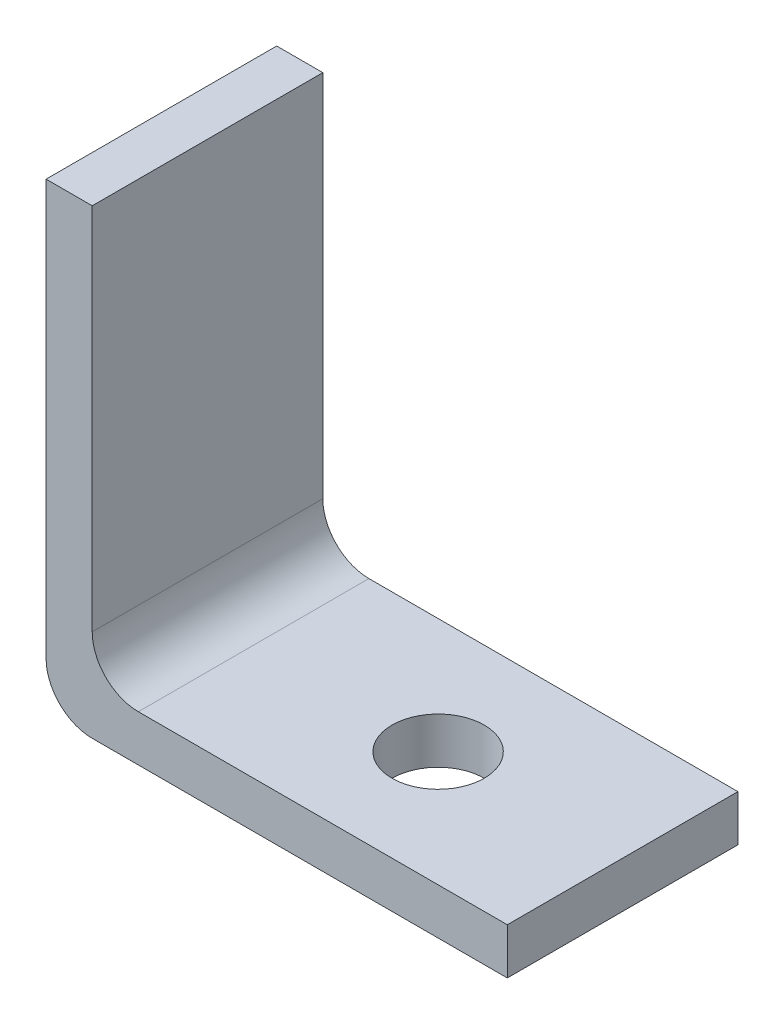
ISO-10303-21;
HEADER;
FILE_DESCRIPTION(('STEP AP214'),'2;1');
FILE_NAME('part.step','',(''),(''),'','','');
FILE_SCHEMA(('AUTOMOTIVE_DESIGN { 1 0 10303 214 1 1 1 1 }'));
ENDSEC;
DATA;
#1=APPLICATION_CONTEXT('core data for automotive mechanical design processes');
#2=APPLICATION_PROTOCOL_DEFINITION('international standard','automotive_design',2000,#1);
#3=PRODUCT_CONTEXT('',#1,'mechanical');
#4=PRODUCT('Part','Part','',(#3));
#5=PRODUCT_RELATED_PRODUCT_CATEGORY('part','',(#4));
#6=PRODUCT_DEFINITION_FORMATION('','',#4);
#7=PRODUCT_DEFINITION_CONTEXT('part definition',#1,'design');
#8=PRODUCT_DEFINITION('design','',#6,#7);
#9=PRODUCT_DEFINITION_SHAPE('','',#8);
#10=(LENGTH_UNIT() NAMED_UNIT(*) SI_UNIT(.MILLI.,.METRE.));
#11=(NAMED_UNIT(*) PLANE_ANGLE_UNIT() SI_UNIT($,.RADIAN.));
#12=(NAMED_UNIT(*) SI_UNIT($,.STERADIAN.) SOLID_ANGLE_UNIT());
#13=UNCERTAINTY_MEASURE_WITH_UNIT(LENGTH_MEASURE(1.E-05),#10,'distance_accuracy_value','');
#14=(GEOMETRIC_REPRESENTATION_CONTEXT(3) GLOBAL_UNCERTAINTY_ASSIGNED_CONTEXT((#13)) GLOBAL_UNIT_ASSIGNED_CONTEXT((#10,
#11,#12)) REPRESENTATION_CONTEXT('',''));
#15=CARTESIAN_POINT('',(0.,0.,0.));
#16=DIRECTION('',(0.,0.,1.));
#17=DIRECTION('',(1.,0.,0.));
#18=AXIS2_PLACEMENT_3D('',#15,#16,#17);
#19=CARTESIAN_POINT('',(10.,100.,50.));
#20=DIRECTION('',(0.,-1.,0.));
#21=DIRECTION('',(0.,0.,-1.));
#22=AXIS2_PLACEMENT_3D('',#19,#20,#21);
#23=PLANE('',#22);
#24=DIRECTION('',(-1.,0.,0.));
#25=VECTOR('',#24,1.);
#26=CARTESIAN_POINT('',(10.,100.,0.));
#27=LINE('',#26,#25);
#28=CARTESIAN_POINT('',(10.,100.,0.));
#29=VERTEX_POINT('',#28);
#30=CARTESIAN_POINT('',(0.,100.,0.));
#31=VERTEX_POINT('',#30);
#32=EDGE_CURVE('E140',#29,#31,#27,.T.);
#33=ORIENTED_EDGE('',*,*,#32,.T.);
#34=DIRECTION('',(0.,0.,-1.));
#35=VECTOR('',#34,1.);
#36=CARTESIAN_POINT('',(0.,100.,50.));
#37=LINE('',#36,#35);
#38=CARTESIAN_POINT('',(0.,100.,50.));
#39=VERTEX_POINT('',#38);
#40=EDGE_CURVE('E11',#39,#31,#37,.T.);
#41=ORIENTED_EDGE('',*,*,#40,.F.);
#42=DIRECTION('',(-1.,0.,0.));
#43=VECTOR('',#42,1.);
#44=CARTESIAN_POINT('',(10.,100.,50.));
#45=LINE('',#44,#43);
#46=CARTESIAN_POINT('',(10.,100.,50.));
#47=VERTEX_POINT('',#46);
#48=EDGE_CURVE('E165',#47,#39,#45,.T.);
#49=ORIENTED_EDGE('',*,*,#48,.F.);
#50=DIRECTION('',(0.,0.,-1.));
#51=VECTOR('',#50,1.);
#52=CARTESIAN_POINT('',(10.,100.,50.));
#53=LINE('',#52,#51);
#54=EDGE_CURVE('E136',#47,#29,#53,.T.);
#55=ORIENTED_EDGE('',*,*,#54,.T.);
#56=EDGE_LOOP('',(#33,#41,#49,#55));
#57=FACE_BOUND('',#56,.T.);
#58=ADVANCED_FACE('F39',(#57),#23,.F.);
#59=CARTESIAN_POINT('',(0.,100.,50.));
#60=DIRECTION('',(1.,0.,0.));
#61=DIRECTION('',(0.,1.,0.));
#62=AXIS2_PLACEMENT_3D('',#59,#60,#61);
#63=PLANE('',#62);
#64=DIRECTION('',(0.,-1.,0.));
#65=VECTOR('',#64,1.);
#66=CARTESIAN_POINT('',(0.,100.,0.));
#67=LINE('',#66,#65);
#68=CARTESIAN_POINT('',(0.,10.0000000000001,0.));
#69=VERTEX_POINT('',#68);
#70=EDGE_CURVE('E144',#31,#69,#67,.T.);
#71=ORIENTED_EDGE('',*,*,#70,.T.);
#72=DIRECTION('',(0.,0.,-1.));
#73=VECTOR('',#72,1.);
#74=CARTESIAN_POINT('',(0.,10.0000000000001,50.));
#75=LINE('',#74,#73);
#76=CARTESIAN_POINT('',(0.,10.0000000000001,50.));
#77=VERTEX_POINT('',#76);
#78=EDGE_CURVE('E48',#77,#69,#75,.T.);
#79=ORIENTED_EDGE('',*,*,#78,.F.);
#80=DIRECTION('',(0.,-1.,0.));
#81=VECTOR('',#80,1.);
#82=CARTESIAN_POINT('',(0.,100.,50.));
#83=LINE('',#82,#81);
#84=EDGE_CURVE('E99',#39,#77,#83,.T.);
#85=ORIENTED_EDGE('',*,*,#84,.F.);
#86=ORIENTED_EDGE('',*,*,#40,.T.);
#87=EDGE_LOOP('',(#71,#79,#85,#86));
#88=FACE_BOUND('',#87,.T.);
#89=ADVANCED_FACE('F185',(#88),#63,.F.);
#90=CARTESIAN_POINT('',(10.,10.,50.));
#91=DIRECTION('',(0.,0.,-1.));
#92=DIRECTION('',(-1.,0.,0.));
#93=AXIS2_PLACEMENT_3D('',#90,#91,#92);
#94=CYLINDRICAL_SURFACE('',#93,10.);
#95=CARTESIAN_POINT('',(10.,10.,0.));
#96=DIRECTION('',(0.,0.,-1.));
#97=DIRECTION('',(-1.,0.,0.));
#98=AXIS2_PLACEMENT_3D('',#95,#96,#97);
#99=CIRCLE('',#98,10.);
#100=CARTESIAN_POINT('',(10.0000000000001,0.,0.));
#101=VERTEX_POINT('',#100);
#102=EDGE_CURVE('E149',#101,#69,#99,.T.);
#103=ORIENTED_EDGE('',*,*,#102,.F.);
#104=DIRECTION('',(0.,0.,-1.));
#105=VECTOR('',#104,1.);
#106=CARTESIAN_POINT('',(10.0000000000001,0.,50.));
#107=LINE('',#106,#105);
#108=CARTESIAN_POINT('',(10.0000000000001,0.,50.));
#109=VERTEX_POINT('',#108);
#110=EDGE_CURVE('E176',#109,#101,#107,.T.);
#111=ORIENTED_EDGE('',*,*,#110,.F.);
#112=CARTESIAN_POINT('',(10.,10.,50.));
#113=DIRECTION('',(0.,0.,-1.));
#114=DIRECTION('',(-1.,0.,0.));
#115=AXIS2_PLACEMENT_3D('',#112,#113,#114);
#116=CIRCLE('',#115,10.);
#117=EDGE_CURVE('E184',#109,#77,#116,.T.);
#118=ORIENTED_EDGE('',*,*,#117,.T.);
#119=ORIENTED_EDGE('',*,*,#78,.T.);
#120=EDGE_LOOP('',(#103,#111,#118,#119));
#121=FACE_BOUND('',#120,.T.);
#122=ADVANCED_FACE('F182',(#121),#94,.T.);
#123=CARTESIAN_POINT('',(10.0000000000001,0.,50.));
#124=DIRECTION('',(0.,1.,0.));
#125=DIRECTION('',(0.,0.,1.));
#126=AXIS2_PLACEMENT_3D('',#123,#124,#125);
#127=PLANE('',#126);
#128=CARTESIAN_POINT('',(60.,0.,25.));
#129=DIRECTION('',(0.,1.,0.));
#130=DIRECTION('',(0.,0.,1.));
#131=AXIS2_PLACEMENT_3D('',#128,#129,#130);
#132=CIRCLE('',#131,9.99999999999999);
#133=CARTESIAN_POINT('',(60.,0.,35.));
#134=VERTEX_POINT('',#133);
#135=EDGE_CURVE('E145',#134,#134,#132,.F.);
#136=ORIENTED_EDGE('',*,*,#135,.F.);
#137=EDGE_LOOP('',(#136));
#138=FACE_BOUND('',#137,.T.);
#139=DIRECTION('',(1.,0.,0.));
#140=VECTOR('',#139,1.);
#141=CARTESIAN_POINT('',(10.0000000000001,0.,0.));
#142=LINE('',#141,#140);
#143=CARTESIAN_POINT('',(100.,0.,0.));
#144=VERTEX_POINT('',#143);
#145=EDGE_CURVE('E153',#101,#144,#142,.T.);
#146=ORIENTED_EDGE('',*,*,#145,.T.);
#147=DIRECTION('',(0.,0.,-1.));
#148=VECTOR('',#147,1.);
#149=CARTESIAN_POINT('',(100.,0.,50.));
#150=LINE('',#149,#148);
#151=CARTESIAN_POINT('',(100.,0.,50.));
#152=VERTEX_POINT('',#151);
#153=EDGE_CURVE('E172',#152,#144,#150,.T.);
#154=ORIENTED_EDGE('',*,*,#153,.F.);
#155=DIRECTION('',(1.,0.,0.));
#156=VECTOR('',#155,1.);
#157=CARTESIAN_POINT('',(10.0000000000001,0.,50.));
#158=LINE('',#157,#156);
#159=EDGE_CURVE('E199',#109,#152,#158,.T.);
#160=ORIENTED_EDGE('',*,*,#159,.F.);
#161=ORIENTED_EDGE('',*,*,#110,.T.);
#162=EDGE_LOOP('',(#146,#154,#160,#161));
#163=FACE_BOUND('',#162,.T.);
#164=ADVANCED_FACE('F194',(#138,#163),#127,.F.);
#165=CARTESIAN_POINT('',(100.,0.,50.));
#166=DIRECTION('',(-1.,0.,0.));
#167=DIRECTION('',(0.,0.,1.));
#168=AXIS2_PLACEMENT_3D('',#165,#166,#167);
#169=PLANE('',#168);
#170=DIRECTION('',(0.,1.,0.));
#171=VECTOR('',#170,1.);
#172=CARTESIAN_POINT('',(100.,0.,0.));
#173=LINE('',#172,#171);
#174=CARTESIAN_POINT('',(100.,10.,0.));
#175=VERTEX_POINT('',#174);
#176=EDGE_CURVE('E156',#144,#175,#173,.T.);
#177=ORIENTED_EDGE('',*,*,#176,.T.);
#178=DIRECTION('',(0.,0.,-1.));
#179=VECTOR('',#178,1.);
#180=CARTESIAN_POINT('',(100.,10.,50.));
#181=LINE('',#180,#179);
#182=CARTESIAN_POINT('',(100.,10.,50.));
#183=VERTEX_POINT('',#182);
#184=EDGE_CURVE('E129',#183,#175,#181,.T.);
#185=ORIENTED_EDGE('',*,*,#184,.F.);
#186=DIRECTION('',(0.,1.,0.));
#187=VECTOR('',#186,1.);
#188=CARTESIAN_POINT('',(100.,0.,50.));
#189=LINE('',#188,#187);
#190=EDGE_CURVE('E118',#152,#183,#189,.T.);
#191=ORIENTED_EDGE('',*,*,#190,.F.);
#192=ORIENTED_EDGE('',*,*,#153,.T.);
#193=EDGE_LOOP('',(#177,#185,#191,#192));
#194=FACE_BOUND('',#193,.T.);
#195=ADVANCED_FACE('F197',(#194),#169,.F.);
#196=CARTESIAN_POINT('',(100.,10.,50.));
#197=DIRECTION('',(0.,-1.,0.));
#198=DIRECTION('',(1.,0.,0.));
#199=AXIS2_PLACEMENT_3D('',#196,#197,#198);
#200=PLANE('',#199);
#201=CARTESIAN_POINT('',(60.,10.,25.));
#202=DIRECTION('',(0.,1.,0.));
#203=DIRECTION('',(-1.,0.,0.));
#204=AXIS2_PLACEMENT_3D('',#201,#202,#203);
#205=CIRCLE('',#204,9.99999999999999);
#206=CARTESIAN_POINT('',(50.,9.99999999999999,25.));
#207=VERTEX_POINT('',#206);
#208=EDGE_CURVE('E212',#207,#207,#205,.T.);
#209=ORIENTED_EDGE('',*,*,#208,.F.);
#210=EDGE_LOOP('',(#209));
#211=FACE_BOUND('',#210,.T.);
#212=DIRECTION('',(-1.,0.,0.));
#213=VECTOR('',#212,1.);
#214=CARTESIAN_POINT('',(100.,10.,0.));
#215=LINE('',#214,#213);
#216=CARTESIAN_POINT('',(20.0000000000001,9.99999999999999,0.));
#217=VERTEX_POINT('',#216);
#218=EDGE_CURVE('E127',#175,#217,#215,.T.);
#219=ORIENTED_EDGE('',*,*,#218,.T.);
#220=DIRECTION('',(0.,0.,-1.));
#221=VECTOR('',#220,1.);
#222=CARTESIAN_POINT('',(20.0000000000001,9.99999999999999,50.));
#223=LINE('',#222,#221);
#224=CARTESIAN_POINT('',(20.0000000000001,9.99999999999999,50.));
#225=VERTEX_POINT('',#224);
#226=EDGE_CURVE('E124',#225,#217,#223,.T.);
#227=ORIENTED_EDGE('',*,*,#226,.F.);
#228=DIRECTION('',(-1.,0.,0.));
#229=VECTOR('',#228,1.);
#230=CARTESIAN_POINT('',(100.,10.,50.));
#231=LINE('',#230,#229);
#232=EDGE_CURVE('E112',#183,#225,#231,.T.);
#233=ORIENTED_EDGE('',*,*,#232,.F.);
#234=ORIENTED_EDGE('',*,*,#184,.T.);
#235=EDGE_LOOP('',(#219,#227,#233,#234));
#236=FACE_BOUND('',#235,.T.);
#237=ADVANCED_FACE('F125',(#211,#236),#200,.F.);
#238=CARTESIAN_POINT('',(20.,20.,50.));
#239=DIRECTION('',(0.,0.,-1.));
#240=DIRECTION('',(-1.,0.,0.));
#241=AXIS2_PLACEMENT_3D('',#238,#239,#240);
#242=CYLINDRICAL_SURFACE('',#241,10.);
#243=CARTESIAN_POINT('',(20.,20.,0.));
#244=DIRECTION('',(0.,0.,-1.));
#245=DIRECTION('',(-1.,0.,0.));
#246=AXIS2_PLACEMENT_3D('',#243,#244,#245);
#247=CIRCLE('',#246,10.);
#248=CARTESIAN_POINT('',(10.,20.,0.));
#249=VERTEX_POINT('',#248);
#250=EDGE_CURVE('E85',#217,#249,#247,.T.);
#251=ORIENTED_EDGE('',*,*,#250,.T.);
#252=DIRECTION('',(0.,0.,-1.));
#253=VECTOR('',#252,1.);
#254=CARTESIAN_POINT('',(10.,20.,50.));
#255=LINE('',#254,#253);
#256=CARTESIAN_POINT('',(10.,20.,50.));
#257=VERTEX_POINT('',#256);
#258=EDGE_CURVE('E130',#257,#249,#255,.T.);
#259=ORIENTED_EDGE('',*,*,#258,.F.);
#260=CARTESIAN_POINT('',(20.,20.,50.));
#261=DIRECTION('',(0.,0.,-1.));
#262=DIRECTION('',(-1.,0.,0.));
#263=AXIS2_PLACEMENT_3D('',#260,#261,#262);
#264=CIRCLE('',#263,10.);
#265=EDGE_CURVE('E116',#225,#257,#264,.T.);
#266=ORIENTED_EDGE('',*,*,#265,.F.);
#267=ORIENTED_EDGE('',*,*,#226,.T.);
#268=EDGE_LOOP('',(#251,#259,#266,#267));
#269=FACE_BOUND('',#268,.T.);
#270=ADVANCED_FACE('F132',(#269),#242,.F.);
#271=CARTESIAN_POINT('',(9.99999999999999,20.0000000000001,50.));
#272=DIRECTION('',(-1.,0.,0.));
#273=DIRECTION('',(0.,-1.,0.));
#274=AXIS2_PLACEMENT_3D('',#271,#272,#273);
#275=PLANE('',#274);
#276=DIRECTION('',(0.,1.,0.));
#277=VECTOR('',#276,1.);
#278=CARTESIAN_POINT('',(9.99999999999999,20.0000000000001,0.));
#279=LINE('',#278,#277);
#280=EDGE_CURVE('E91',#249,#29,#279,.T.);
#281=ORIENTED_EDGE('',*,*,#280,.T.);
#282=ORIENTED_EDGE('',*,*,#54,.F.);
#283=DIRECTION('',(0.,1.,0.));
#284=VECTOR('',#283,1.);
#285=CARTESIAN_POINT('',(9.99999999999999,20.0000000000001,50.));
#286=LINE('',#285,#284);
#287=EDGE_CURVE('E56',#257,#47,#286,.T.);
#288=ORIENTED_EDGE('',*,*,#287,.F.);
#289=ORIENTED_EDGE('',*,*,#258,.T.);
#290=EDGE_LOOP('',(#281,#282,#288,#289));
#291=FACE_BOUND('',#290,.T.);
#292=ADVANCED_FACE('F225',(#291),#275,.F.);
#293=CARTESIAN_POINT('',(10.,10.,50.));
#294=DIRECTION('',(0.,0.,-1.));
#295=DIRECTION('',(-1.,0.,0.));
#296=AXIS2_PLACEMENT_3D('',#293,#294,#295);
#297=PLANE('',#296);
#298=ORIENTED_EDGE('',*,*,#48,.T.);
#299=ORIENTED_EDGE('',*,*,#84,.T.);
#300=ORIENTED_EDGE('',*,*,#117,.F.);
#301=ORIENTED_EDGE('',*,*,#159,.T.);
#302=ORIENTED_EDGE('',*,*,#190,.T.);
#303=ORIENTED_EDGE('',*,*,#232,.T.);
#304=ORIENTED_EDGE('',*,*,#265,.T.);
#305=ORIENTED_EDGE('',*,*,#287,.T.);
#306=EDGE_LOOP('',(#298,#299,#300,#301,#302,#303,#304,#305));
#307=FACE_BOUND('',#306,.T.);
#308=ADVANCED_FACE('F114',(#307),#297,.F.);
#309=CARTESIAN_POINT('',(10.,10.,0.));
#310=DIRECTION('',(0.,0.,-1.));
#311=DIRECTION('',(-1.,0.,0.));
#312=AXIS2_PLACEMENT_3D('',#309,#310,#311);
#313=PLANE('',#312);
#314=ORIENTED_EDGE('',*,*,#32,.F.);
#315=ORIENTED_EDGE('',*,*,#280,.F.);
#316=ORIENTED_EDGE('',*,*,#250,.F.);
#317=ORIENTED_EDGE('',*,*,#218,.F.);
#318=ORIENTED_EDGE('',*,*,#176,.F.);
#319=ORIENTED_EDGE('',*,*,#145,.F.);
#320=ORIENTED_EDGE('',*,*,#102,.T.);
#321=ORIENTED_EDGE('',*,*,#70,.F.);
#322=EDGE_LOOP('',(#314,#315,#316,#317,#318,#319,#320,#321));
#323=FACE_BOUND('',#322,.T.);
#324=ADVANCED_FACE('F190',(#323),#313,.T.);
#325=CARTESIAN_POINT('',(60.,-28.2842712474619,25.));
#326=DIRECTION('',(0.,1.,0.));
#327=DIRECTION('',(-1.,0.,0.));
#328=AXIS2_PLACEMENT_3D('',#325,#326,#327);
#329=CYLINDRICAL_SURFACE('',#328,9.99999999999999);
#330=ORIENTED_EDGE('',*,*,#135,.T.);
#331=EDGE_LOOP('',(#330));
#332=FACE_BOUND('',#331,.T.);
#333=ORIENTED_EDGE('',*,*,#208,.T.);
#334=EDGE_LOOP('',(#333));
#335=FACE_BOUND('',#334,.T.);
#336=ADVANCED_FACE('F217',(#332,#335),#329,.F.);
#337=CLOSED_SHELL('',(#58,#89,#122,#164,#195,#237,#270,#292,#308,#324,#336));
#338=MANIFOLD_SOLID_BREP('B2',#337);
#339=ADVANCED_BREP_SHAPE_REPRESENTATION('',(#18,#338),#14);
#340=SHAPE_DEFINITION_REPRESENTATION(#9,#339);
ENDSEC;
END-ISO-10303-21;
